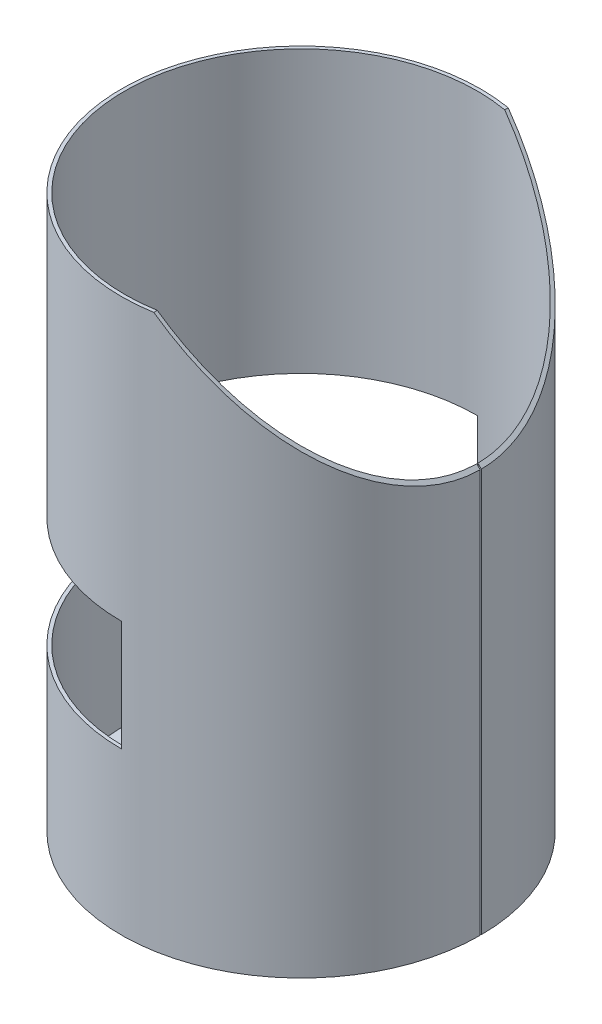
ISO-10303-21;
HEADER;
FILE_DESCRIPTION(('STEP AP214'),'2;1');
FILE_NAME('part.step','',(''),(''),'','','');
FILE_SCHEMA(('AUTOMOTIVE_DESIGN { 1 0 10303 214 1 1 1 1 }'));
ENDSEC;
DATA;
#1=APPLICATION_CONTEXT('core data for automotive mechanical design processes');
#2=APPLICATION_PROTOCOL_DEFINITION('international standard','automotive_design',2000,#1);
#3=PRODUCT_CONTEXT('',#1,'mechanical');
#4=PRODUCT('Part','Part','',(#3));
#5=PRODUCT_RELATED_PRODUCT_CATEGORY('part','',(#4));
#6=PRODUCT_DEFINITION_FORMATION('','',#4);
#7=PRODUCT_DEFINITION_CONTEXT('part definition',#1,'design');
#8=PRODUCT_DEFINITION('design','',#6,#7);
#9=PRODUCT_DEFINITION_SHAPE('','',#8);
#10=(LENGTH_UNIT() NAMED_UNIT(*) SI_UNIT(.MILLI.,.METRE.));
#11=(NAMED_UNIT(*) PLANE_ANGLE_UNIT() SI_UNIT($,.RADIAN.));
#12=(NAMED_UNIT(*) SI_UNIT($,.STERADIAN.) SOLID_ANGLE_UNIT());
#13=UNCERTAINTY_MEASURE_WITH_UNIT(LENGTH_MEASURE(1.E-05),#10,'distance_accuracy_value','');
#14=(GEOMETRIC_REPRESENTATION_CONTEXT(3) GLOBAL_UNCERTAINTY_ASSIGNED_CONTEXT((#13)) GLOBAL_UNIT_ASSIGNED_CONTEXT((#10,
#11,#12)) REPRESENTATION_CONTEXT('',''));
#15=CARTESIAN_POINT('',(0.,0.,0.));
#16=DIRECTION('',(0.,0.,1.));
#17=DIRECTION('',(1.,0.,0.));
#18=AXIS2_PLACEMENT_3D('',#15,#16,#17);
#19=CARTESIAN_POINT('',(0.,520.,0.));
#20=DIRECTION('',(0.,-1.,0.));
#21=DIRECTION('',(0.,0.,-1.));
#22=AXIS2_PLACEMENT_3D('',#19,#20,#21);
#23=CYLINDRICAL_SURFACE('',#22,156.);
#24=DIRECTION('',(0.,1.,0.));
#25=VECTOR('',#24,1.);
#26=CARTESIAN_POINT('',(0.,140.,-156.));
#27=LINE('',#26,#25);
#28=CARTESIAN_POINT('',(0.,140.,-156.));
#29=VERTEX_POINT('',#28);
#30=CARTESIAN_POINT('',(0.,236.,-156.));
#31=VERTEX_POINT('',#30);
#32=EDGE_CURVE('E175',#29,#31,#27,.T.);
#33=ORIENTED_EDGE('',*,*,#32,.T.);
#34=CARTESIAN_POINT('',(0.,236.,0.));
#35=DIRECTION('',(0.,1.,0.));
#36=DIRECTION('',(-1.,0.,0.));
#37=AXIS2_PLACEMENT_3D('',#34,#35,#36);
#38=CIRCLE('',#37,156.);
#39=CARTESIAN_POINT('',(0.,236.,156.));
#40=VERTEX_POINT('',#39);
#41=EDGE_CURVE('E182',#31,#40,#38,.T.);
#42=ORIENTED_EDGE('',*,*,#41,.T.);
#43=DIRECTION('',(0.,1.,0.));
#44=VECTOR('',#43,1.);
#45=CARTESIAN_POINT('',(0.,140.,156.));
#46=LINE('',#45,#44);
#47=CARTESIAN_POINT('',(0.,140.,156.));
#48=VERTEX_POINT('',#47);
#49=EDGE_CURVE('E172',#48,#40,#46,.T.);
#50=ORIENTED_EDGE('',*,*,#49,.F.);
#51=CARTESIAN_POINT('',(0.,140.,0.));
#52=DIRECTION('',(0.,-1.,0.));
#53=DIRECTION('',(1.,0.,0.));
#54=AXIS2_PLACEMENT_3D('',#51,#52,#53);
#55=CIRCLE('',#54,156.);
#56=EDGE_CURVE('E187',#48,#29,#55,.T.);
#57=ORIENTED_EDGE('',*,*,#56,.T.);
#58=EDGE_LOOP('',(#33,#42,#50,#57));
#59=FACE_BOUND('',#58,.T.);
#60=DIRECTION('',(0.,-1.,0.));
#61=VECTOR('',#60,1.);
#62=CARTESIAN_POINT('',(155.999198715891,520.,0.500000000000221));
#63=LINE('',#62,#61);
#64=CARTESIAN_POINT('',(155.999198715891,350.000801284109,0.50000000000014));
#65=VERTEX_POINT('',#64);
#66=CARTESIAN_POINT('',(155.999198715891,0.,0.5));
#67=VERTEX_POINT('',#66);
#68=EDGE_CURVE('E129',#65,#67,#63,.T.);
#69=ORIENTED_EDGE('',*,*,#68,.F.);
#70=CARTESIAN_POINT('',(0.,506.000000000002,0.));
#71=DIRECTION('',(-0.707106781186551,-0.707106781186544,0.));
#72=DIRECTION('',(0.707106781186544,-0.707106781186551,0.));
#73=AXIS2_PLACEMENT_3D('',#70,#71,#72);
#74=ELLIPSE('',#73,220.617315730204,156.);
#75=CARTESIAN_POINT('',(26.0000000000014,480.,153.81807436059));
#76=VERTEX_POINT('',#75);
#77=EDGE_CURVE('E168',#65,#76,#74,.T.);
#78=ORIENTED_EDGE('',*,*,#77,.T.);
#79=CARTESIAN_POINT('',(0.,480.,0.));
#80=DIRECTION('',(0.,-1.,0.));
#81=DIRECTION('',(0.,0.,-1.));
#82=AXIS2_PLACEMENT_3D('',#79,#80,#81);
#83=CIRCLE('',#82,156.);
#84=CARTESIAN_POINT('',(26.0000000000014,480.,-153.81807436059));
#85=VERTEX_POINT('',#84);
#86=EDGE_CURVE('E166',#76,#85,#83,.T.);
#87=ORIENTED_EDGE('',*,*,#86,.T.);
#88=CARTESIAN_POINT('',(155.999198715891,350.000801284109,-0.500000000000021));
#89=VERTEX_POINT('',#88);
#90=EDGE_CURVE('E169',#85,#89,#74,.T.);
#91=ORIENTED_EDGE('',*,*,#90,.T.);
#92=DIRECTION('',(0.,-1.,0.));
#93=VECTOR('',#92,1.);
#94=CARTESIAN_POINT('',(155.999198715891,520.,-0.50000000000003));
#95=LINE('',#94,#93);
#96=CARTESIAN_POINT('',(155.999198715891,0.,-0.5));
#97=VERTEX_POINT('',#96);
#98=EDGE_CURVE('E48',#97,#89,#95,.F.);
#99=ORIENTED_EDGE('',*,*,#98,.F.);
#100=CARTESIAN_POINT('',(0.,0.,0.));
#101=DIRECTION('',(0.,1.,0.));
#102=DIRECTION('',(0.,0.,1.));
#103=AXIS2_PLACEMENT_3D('',#100,#101,#102);
#104=CIRCLE('',#103,156.);
#105=EDGE_CURVE('E190',#97,#67,#104,.T.);
#106=ORIENTED_EDGE('',*,*,#105,.T.);
#107=EDGE_LOOP('',(#69,#78,#87,#91,#99,#106));
#108=FACE_BOUND('',#107,.T.);
#109=ADVANCED_FACE('F33',(#59,#108),#23,.T.);
#110=CARTESIAN_POINT('',(0.,0.,0.));
#111=DIRECTION('',(0.,1.,0.));
#112=DIRECTION('',(0.,0.,1.));
#113=AXIS2_PLACEMENT_3D('',#110,#111,#112);
#114=PLANE('',#113);
#115=DIRECTION('',(-1.,0.,0.));
#116=VECTOR('',#115,1.);
#117=CARTESIAN_POINT('',(156.,0.,0.5));
#118=LINE('',#117,#116);
#119=CARTESIAN_POINT('',(0.,0.,0.5));
#120=VERTEX_POINT('',#119);
#121=EDGE_CURVE('E123',#67,#120,#118,.T.);
#122=ORIENTED_EDGE('',*,*,#121,.F.);
#123=ORIENTED_EDGE('',*,*,#105,.F.);
#124=DIRECTION('',(-1.,0.,0.));
#125=VECTOR('',#124,1.);
#126=CARTESIAN_POINT('',(156.,0.,-0.5));
#127=LINE('',#126,#125);
#128=CARTESIAN_POINT('',(0.,0.,-0.5));
#129=VERTEX_POINT('',#128);
#130=EDGE_CURVE('E135',#97,#129,#127,.T.);
#131=ORIENTED_EDGE('',*,*,#130,.T.);
#132=DIRECTION('',(0.,0.,-1.));
#133=VECTOR('',#132,1.);
#134=CARTESIAN_POINT('',(0.,0.,0.5));
#135=LINE('',#134,#133);
#136=EDGE_CURVE('E140',#120,#129,#135,.T.);
#137=ORIENTED_EDGE('',*,*,#136,.F.);
#138=EDGE_LOOP('',(#122,#123,#131,#137));
#139=FACE_BOUND('',#138,.T.);
#140=ADVANCED_FACE('F145',(#139),#114,.F.);
#141=CARTESIAN_POINT('',(0.,520.,0.));
#142=DIRECTION('',(0.,-1.,0.));
#143=DIRECTION('',(0.,0.,-1.));
#144=AXIS2_PLACEMENT_3D('',#141,#142,#143);
#145=CYLINDRICAL_SURFACE('',#144,153.);
#146=CARTESIAN_POINT('',(0.,140.,0.));
#147=DIRECTION('',(0.,-1.,0.));
#148=DIRECTION('',(1.,0.,0.));
#149=AXIS2_PLACEMENT_3D('',#146,#147,#148);
#150=CIRCLE('',#149,153.);
#151=CARTESIAN_POINT('',(0.,140.,153.));
#152=VERTEX_POINT('',#151);
#153=CARTESIAN_POINT('',(0.,140.,-153.));
#154=VERTEX_POINT('',#153);
#155=EDGE_CURVE('E202',#152,#154,#150,.T.);
#156=ORIENTED_EDGE('',*,*,#155,.F.);
#157=DIRECTION('',(0.,-1.,0.));
#158=VECTOR('',#157,1.);
#159=CARTESIAN_POINT('',(0.,520.,153.));
#160=LINE('',#159,#158);
#161=CARTESIAN_POINT('',(0.,236.,153.));
#162=VERTEX_POINT('',#161);
#163=EDGE_CURVE('E200',#162,#152,#160,.T.);
#164=ORIENTED_EDGE('',*,*,#163,.F.);
#165=CARTESIAN_POINT('',(0.,236.,0.));
#166=DIRECTION('',(0.,1.,0.));
#167=DIRECTION('',(-1.,0.,0.));
#168=AXIS2_PLACEMENT_3D('',#165,#166,#167);
#169=CIRCLE('',#168,153.);
#170=CARTESIAN_POINT('',(0.,236.,-153.));
#171=VERTEX_POINT('',#170);
#172=EDGE_CURVE('E195',#171,#162,#169,.T.);
#173=ORIENTED_EDGE('',*,*,#172,.F.);
#174=DIRECTION('',(0.,-1.,0.));
#175=VECTOR('',#174,1.);
#176=CARTESIAN_POINT('',(0.,520.,-153.));
#177=LINE('',#176,#175);
#178=EDGE_CURVE('E197',#154,#171,#177,.F.);
#179=ORIENTED_EDGE('',*,*,#178,.F.);
#180=EDGE_LOOP('',(#156,#164,#173,#179));
#181=FACE_BOUND('',#180,.T.);
#182=CARTESIAN_POINT('',(0.,506.000000000002,0.));
#183=DIRECTION('',(-0.707106781186551,-0.707106781186544,0.));
#184=DIRECTION('',(0.707106781186544,-0.707106781186551,0.));
#185=AXIS2_PLACEMENT_3D('',#182,#183,#184);
#186=ELLIPSE('',#185,216.374675043085,153.);
#187=CARTESIAN_POINT('',(152.999183004355,353.000816995646,0.50000000000015));
#188=VERTEX_POINT('',#187);
#189=CARTESIAN_POINT('',(26.0000000000014,480.,150.774666307042));
#190=VERTEX_POINT('',#189);
#191=EDGE_CURVE('E56',#188,#190,#186,.T.);
#192=ORIENTED_EDGE('',*,*,#191,.F.);
#193=DIRECTION('',(0.,-1.,0.));
#194=VECTOR('',#193,1.);
#195=CARTESIAN_POINT('',(152.999183004355,520.,0.500000000000221));
#196=LINE('',#195,#194);
#197=CARTESIAN_POINT('',(152.999183004355,3.,0.500000000000221));
#198=VERTEX_POINT('',#197);
#199=EDGE_CURVE('E157',#188,#198,#196,.T.);
#200=ORIENTED_EDGE('',*,*,#199,.T.);
#201=CARTESIAN_POINT('',(0.,3.,0.));
#202=DIRECTION('',(0.,1.,0.));
#203=DIRECTION('',(0.,0.,1.));
#204=AXIS2_PLACEMENT_3D('',#201,#202,#203);
#205=CIRCLE('',#204,153.);
#206=CARTESIAN_POINT('',(152.999183004355,3.,-0.50000000000003));
#207=VERTEX_POINT('',#206);
#208=EDGE_CURVE('E192',#207,#198,#205,.T.);
#209=ORIENTED_EDGE('',*,*,#208,.F.);
#210=DIRECTION('',(0.,-1.,0.));
#211=VECTOR('',#210,1.);
#212=CARTESIAN_POINT('',(152.999183004355,520.,-0.50000000000003));
#213=LINE('',#212,#211);
#214=CARTESIAN_POINT('',(152.999183004355,353.000816995646,-0.500000000000021));
#215=VERTEX_POINT('',#214);
#216=EDGE_CURVE('E134',#207,#215,#213,.F.);
#217=ORIENTED_EDGE('',*,*,#216,.T.);
#218=CARTESIAN_POINT('',(26.0000000000014,480.,-150.774666307042));
#219=VERTEX_POINT('',#218);
#220=EDGE_CURVE('E206',#219,#215,#186,.T.);
#221=ORIENTED_EDGE('',*,*,#220,.F.);
#222=CARTESIAN_POINT('',(0.,480.,0.));
#223=DIRECTION('',(0.,-1.,0.));
#224=DIRECTION('',(0.,0.,-1.));
#225=AXIS2_PLACEMENT_3D('',#222,#223,#224);
#226=CIRCLE('',#225,153.);
#227=EDGE_CURVE('E204',#190,#219,#226,.T.);
#228=ORIENTED_EDGE('',*,*,#227,.F.);
#229=EDGE_LOOP('',(#192,#200,#209,#217,#221,#228));
#230=FACE_BOUND('',#229,.T.);
#231=ADVANCED_FACE('F221',(#181,#230),#145,.F.);
#232=CARTESIAN_POINT('',(0.,3.,0.));
#233=DIRECTION('',(0.,1.,0.));
#234=DIRECTION('',(0.,0.,1.));
#235=AXIS2_PLACEMENT_3D('',#232,#233,#234);
#236=PLANE('',#235);
#237=ORIENTED_EDGE('',*,*,#208,.T.);
#238=DIRECTION('',(-1.,0.,0.));
#239=VECTOR('',#238,1.);
#240=CARTESIAN_POINT('',(0.,3.,0.500000000000002));
#241=LINE('',#240,#239);
#242=CARTESIAN_POINT('',(0.,3.,0.500000000000002));
#243=VERTEX_POINT('',#242);
#244=EDGE_CURVE('E161',#198,#243,#241,.T.);
#245=ORIENTED_EDGE('',*,*,#244,.T.);
#246=DIRECTION('',(0.,0.,1.));
#247=VECTOR('',#246,1.);
#248=CARTESIAN_POINT('',(0.,3.,0.));
#249=LINE('',#248,#247);
#250=CARTESIAN_POINT('',(0.,3.,-0.500000000000001));
#251=VERTEX_POINT('',#250);
#252=EDGE_CURVE('E11',#251,#243,#249,.T.);
#253=ORIENTED_EDGE('',*,*,#252,.F.);
#254=DIRECTION('',(1.,0.,0.));
#255=VECTOR('',#254,1.);
#256=CARTESIAN_POINT('',(0.,3.,-0.500000000000001));
#257=LINE('',#256,#255);
#258=EDGE_CURVE('E154',#251,#207,#257,.T.);
#259=ORIENTED_EDGE('',*,*,#258,.T.);
#260=EDGE_LOOP('',(#237,#245,#253,#259));
#261=FACE_BOUND('',#260,.T.);
#262=ADVANCED_FACE('F35',(#261),#236,.T.);
#263=CARTESIAN_POINT('',(26.0000000000014,480.,-156.));
#264=DIRECTION('',(-0.707106781186551,-0.707106781186544,0.));
#265=DIRECTION('',(0.707106781186544,-0.707106781186551,0.));
#266=AXIS2_PLACEMENT_3D('',#263,#264,#265);
#267=PLANE('',#266);
#268=DIRECTION('',(0.707106781186544,-0.707106781186551,0.));
#269=VECTOR('',#268,1.);
#270=CARTESIAN_POINT('',(26.0000000000014,480.,0.500000000000195));
#271=LINE('',#270,#269);
#272=EDGE_CURVE('E41',#188,#65,#271,.T.);
#273=ORIENTED_EDGE('',*,*,#272,.F.);
#274=ORIENTED_EDGE('',*,*,#191,.T.);
#275=DIRECTION('',(0.,0.,1.));
#276=VECTOR('',#275,1.);
#277=CARTESIAN_POINT('',(26.0000000000014,480.,-156.));
#278=LINE('',#277,#276);
#279=EDGE_CURVE('E163',#190,#76,#278,.T.);
#280=ORIENTED_EDGE('',*,*,#279,.T.);
#281=ORIENTED_EDGE('',*,*,#77,.F.);
#282=EDGE_LOOP('',(#273,#274,#280,#281));
#283=FACE_BOUND('',#282,.T.);
#284=ADVANCED_FACE('F213',(#283),#267,.F.);
#285=DIRECTION('',(-0.707106781186544,0.707106781186551,0.));
#286=VECTOR('',#285,1.);
#287=CARTESIAN_POINT('',(26.0000000000014,480.,-0.500000000000028));
#288=LINE('',#287,#286);
#289=EDGE_CURVE('E209',#89,#215,#288,.T.);
#290=ORIENTED_EDGE('',*,*,#289,.F.);
#291=ORIENTED_EDGE('',*,*,#90,.F.);
#292=EDGE_CURVE('E165',#85,#219,#278,.T.);
#293=ORIENTED_EDGE('',*,*,#292,.T.);
#294=ORIENTED_EDGE('',*,*,#220,.T.);
#295=EDGE_LOOP('',(#290,#291,#293,#294));
#296=FACE_BOUND('',#295,.T.);
#297=ADVANCED_FACE('F224',(#296),#267,.F.);
#298=CARTESIAN_POINT('',(0.,140.,-156.));
#299=DIRECTION('',(1.,0.,0.));
#300=DIRECTION('',(0.,0.,-1.));
#301=AXIS2_PLACEMENT_3D('',#298,#299,#300);
#302=PLANE('',#301);
#303=ORIENTED_EDGE('',*,*,#163,.T.);
#304=DIRECTION('',(0.,0.,1.));
#305=VECTOR('',#304,1.);
#306=CARTESIAN_POINT('',(0.,140.,-156.));
#307=LINE('',#306,#305);
#308=EDGE_CURVE('E183',#152,#48,#307,.T.);
#309=ORIENTED_EDGE('',*,*,#308,.T.);
#310=ORIENTED_EDGE('',*,*,#49,.T.);
#311=DIRECTION('',(0.,0.,1.));
#312=VECTOR('',#311,1.);
#313=CARTESIAN_POINT('',(0.,236.,-156.));
#314=LINE('',#313,#312);
#315=EDGE_CURVE('E178',#162,#40,#314,.T.);
#316=ORIENTED_EDGE('',*,*,#315,.F.);
#317=EDGE_LOOP('',(#303,#309,#310,#316));
#318=FACE_BOUND('',#317,.T.);
#319=ADVANCED_FACE('F248',(#318),#302,.F.);
#320=CARTESIAN_POINT('',(0.,140.,-156.));
#321=DIRECTION('',(0.,-1.,0.));
#322=DIRECTION('',(1.,0.,0.));
#323=AXIS2_PLACEMENT_3D('',#320,#321,#322);
#324=PLANE('',#323);
#325=ORIENTED_EDGE('',*,*,#308,.F.);
#326=ORIENTED_EDGE('',*,*,#155,.T.);
#327=EDGE_CURVE('E179',#29,#154,#307,.T.);
#328=ORIENTED_EDGE('',*,*,#327,.F.);
#329=ORIENTED_EDGE('',*,*,#56,.F.);
#330=EDGE_LOOP('',(#325,#326,#328,#329));
#331=FACE_BOUND('',#330,.T.);
#332=ADVANCED_FACE('F251',(#331),#324,.F.);
#333=CARTESIAN_POINT('',(0.,236.,-156.));
#334=DIRECTION('',(0.,1.,0.));
#335=DIRECTION('',(-1.,0.,0.));
#336=AXIS2_PLACEMENT_3D('',#333,#334,#335);
#337=PLANE('',#336);
#338=ORIENTED_EDGE('',*,*,#41,.F.);
#339=EDGE_CURVE('E184',#31,#171,#314,.T.);
#340=ORIENTED_EDGE('',*,*,#339,.T.);
#341=ORIENTED_EDGE('',*,*,#172,.T.);
#342=ORIENTED_EDGE('',*,*,#315,.T.);
#343=EDGE_LOOP('',(#338,#340,#341,#342));
#344=FACE_BOUND('',#343,.T.);
#345=ADVANCED_FACE('F246',(#344),#337,.F.);
#346=ORIENTED_EDGE('',*,*,#178,.T.);
#347=ORIENTED_EDGE('',*,*,#339,.F.);
#348=ORIENTED_EDGE('',*,*,#32,.F.);
#349=ORIENTED_EDGE('',*,*,#327,.T.);
#350=EDGE_LOOP('',(#346,#347,#348,#349));
#351=FACE_BOUND('',#350,.T.);
#352=ADVANCED_FACE('F243',(#351),#302,.F.);
#353=CARTESIAN_POINT('',(-156.,480.,-156.));
#354=DIRECTION('',(0.,-1.,0.));
#355=DIRECTION('',(0.,0.,-1.));
#356=AXIS2_PLACEMENT_3D('',#353,#354,#355);
#357=PLANE('',#356);
#358=ORIENTED_EDGE('',*,*,#86,.F.);
#359=ORIENTED_EDGE('',*,*,#279,.F.);
#360=ORIENTED_EDGE('',*,*,#227,.T.);
#361=ORIENTED_EDGE('',*,*,#292,.F.);
#362=EDGE_LOOP('',(#358,#359,#360,#361));
#363=FACE_BOUND('',#362,.T.);
#364=ADVANCED_FACE('F216',(#363),#357,.F.);
#365=CARTESIAN_POINT('',(156.,0.,0.5));
#366=DIRECTION('',(0.,0.,-1.));
#367=DIRECTION('',(0.,1.,0.));
#368=AXIS2_PLACEMENT_3D('',#365,#366,#367);
#369=PLANE('',#368);
#370=ORIENTED_EDGE('',*,*,#199,.F.);
#371=ORIENTED_EDGE('',*,*,#272,.T.);
#372=ORIENTED_EDGE('',*,*,#68,.T.);
#373=ORIENTED_EDGE('',*,*,#121,.T.);
#374=DIRECTION('',(0.,-1.,0.));
#375=VECTOR('',#374,1.);
#376=CARTESIAN_POINT('',(0.,0.,0.5));
#377=LINE('',#376,#375);
#378=EDGE_CURVE('E126',#243,#120,#377,.T.);
#379=ORIENTED_EDGE('',*,*,#378,.F.);
#380=ORIENTED_EDGE('',*,*,#244,.F.);
#381=EDGE_LOOP('',(#370,#371,#372,#373,#379,#380));
#382=FACE_BOUND('',#381,.T.);
#383=ADVANCED_FACE('F125',(#382),#369,.T.);
#384=CARTESIAN_POINT('',(156.,0.,-0.5));
#385=DIRECTION('',(0.,0.,1.));
#386=DIRECTION('',(0.,-1.,0.));
#387=AXIS2_PLACEMENT_3D('',#384,#385,#386);
#388=PLANE('',#387);
#389=DIRECTION('',(0.,1.,0.));
#390=VECTOR('',#389,1.);
#391=CARTESIAN_POINT('',(0.,0.,-0.5));
#392=LINE('',#391,#390);
#393=EDGE_CURVE('E146',#129,#251,#392,.T.);
#394=ORIENTED_EDGE('',*,*,#393,.F.);
#395=ORIENTED_EDGE('',*,*,#130,.F.);
#396=ORIENTED_EDGE('',*,*,#98,.T.);
#397=ORIENTED_EDGE('',*,*,#289,.T.);
#398=ORIENTED_EDGE('',*,*,#216,.F.);
#399=ORIENTED_EDGE('',*,*,#258,.F.);
#400=EDGE_LOOP('',(#394,#395,#396,#397,#398,#399));
#401=FACE_BOUND('',#400,.T.);
#402=ADVANCED_FACE('F226',(#401),#388,.T.);
#403=CARTESIAN_POINT('',(0.,0.,0.));
#404=DIRECTION('',(-1.,0.,0.));
#405=DIRECTION('',(0.,0.,1.));
#406=AXIS2_PLACEMENT_3D('',#403,#404,#405);
#407=PLANE('',#406);
#408=ORIENTED_EDGE('',*,*,#252,.T.);
#409=ORIENTED_EDGE('',*,*,#378,.T.);
#410=ORIENTED_EDGE('',*,*,#136,.T.);
#411=ORIENTED_EDGE('',*,*,#393,.T.);
#412=EDGE_LOOP('',(#408,#409,#410,#411));
#413=FACE_BOUND('',#412,.T.);
#414=ADVANCED_FACE('F138',(#413),#407,.F.);
#415=CLOSED_SHELL('',(#109,#140,#231,#262,#284,#297,#319,#332,#345,#352,#364,#383,#402,#414));
#416=MANIFOLD_SOLID_BREP('B2',#415);
#417=ADVANCED_BREP_SHAPE_REPRESENTATION('',(#18,#416),#14);
#418=SHAPE_DEFINITION_REPRESENTATION(#9,#417);
ENDSEC;
END-ISO-10303-21;
